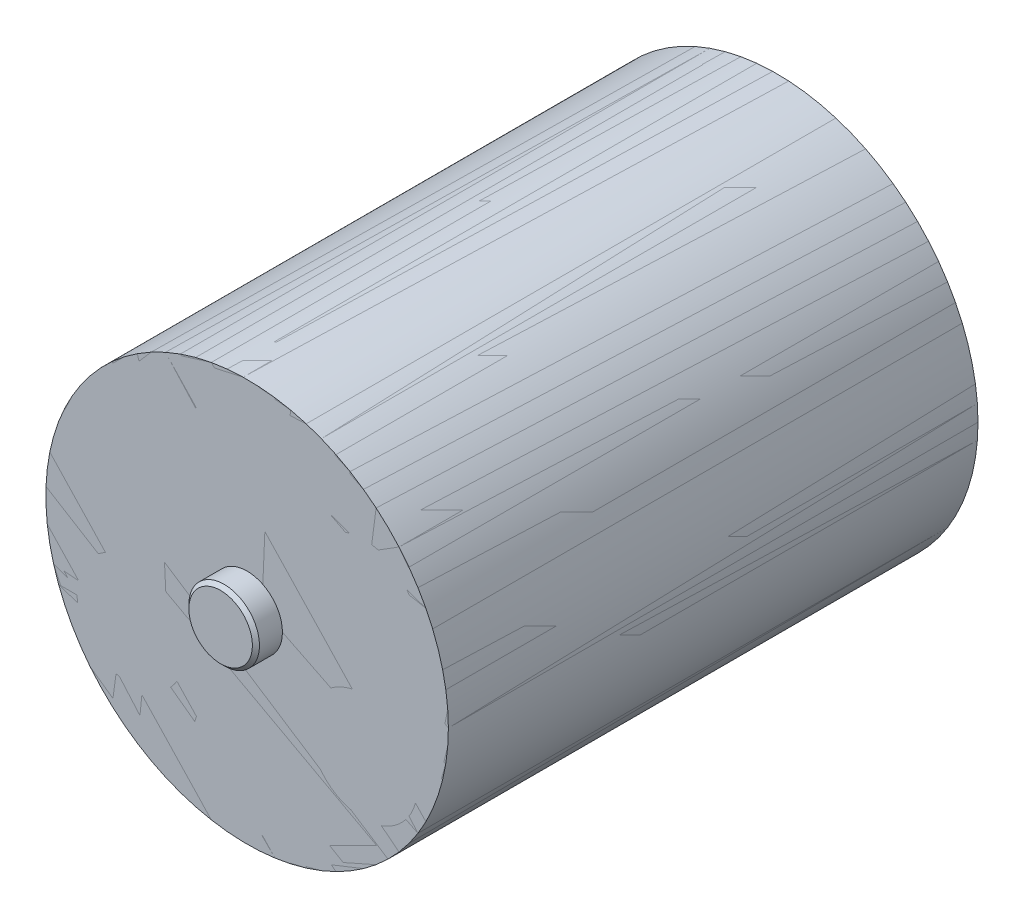
ISO-10303-21;
HEADER;
FILE_DESCRIPTION(('STEP AP214'),'2;1');
FILE_NAME('part.step','',(''),(''),'','','');
FILE_SCHEMA(('AUTOMOTIVE_DESIGN { 1 0 10303 214 1 1 1 1 }'));
ENDSEC;
DATA;
#1=APPLICATION_CONTEXT('core data for automotive mechanical design processes');
#2=APPLICATION_PROTOCOL_DEFINITION('international standard','automotive_design',2000,#1);
#3=PRODUCT_CONTEXT('',#1,'mechanical');
#4=PRODUCT('Part','Part','',(#3));
#5=PRODUCT_RELATED_PRODUCT_CATEGORY('part','',(#4));
#6=PRODUCT_DEFINITION_FORMATION('','',#4);
#7=PRODUCT_DEFINITION_CONTEXT('part definition',#1,'design');
#8=PRODUCT_DEFINITION('design','',#6,#7);
#9=PRODUCT_DEFINITION_SHAPE('','',#8);
#10=(LENGTH_UNIT() NAMED_UNIT(*) SI_UNIT(.MILLI.,.METRE.));
#11=(NAMED_UNIT(*) PLANE_ANGLE_UNIT() SI_UNIT($,.RADIAN.));
#12=(NAMED_UNIT(*) SI_UNIT($,.STERADIAN.) SOLID_ANGLE_UNIT());
#13=UNCERTAINTY_MEASURE_WITH_UNIT(LENGTH_MEASURE(1.E-05),#10,'distance_accuracy_value','');
#14=(GEOMETRIC_REPRESENTATION_CONTEXT(3) GLOBAL_UNCERTAINTY_ASSIGNED_CONTEXT((#13)) GLOBAL_UNIT_ASSIGNED_CONTEXT((#10,
#11,#12)) REPRESENTATION_CONTEXT('',''));
#15=CARTESIAN_POINT('',(0.,0.,0.));
#16=DIRECTION('',(0.,0.,1.));
#17=DIRECTION('',(1.,0.,0.));
#18=AXIS2_PLACEMENT_3D('',#15,#16,#17);
#19=CARTESIAN_POINT('',(271.211975438826,413.994449049259,-472.440692221066));
#20=DIRECTION('',(0.,0.,1.));
#21=DIRECTION('',(1.,0.,0.));
#22=AXIS2_PLACEMENT_3D('',#19,#20,#21);
#23=CYLINDRICAL_SURFACE('',#22,114.);
#24=CARTESIAN_POINT('',(271.211975438826,413.994449049259,-150.));
#25=DIRECTION('',(0.,0.,1.));
#26=DIRECTION('',(1.,0.,0.));
#27=AXIS2_PLACEMENT_3D('',#24,#25,#26);
#28=CIRCLE('',#27,114.);
#29=CARTESIAN_POINT('',(385.211975438826,413.994449049259,-150.));
#30=VERTEX_POINT('',#29);
#31=EDGE_CURVE('E11',#30,#30,#28,.F.);
#32=ORIENTED_EDGE('',*,*,#31,.F.);
#33=EDGE_LOOP('',(#32));
#34=FACE_BOUND('',#33,.T.);
#35=CARTESIAN_POINT('',(271.211975438826,413.994449049259,150.));
#36=DIRECTION('',(0.,0.,1.));
#37=DIRECTION('',(1.,0.,0.));
#38=AXIS2_PLACEMENT_3D('',#35,#36,#37);
#39=CIRCLE('',#38,114.);
#40=CARTESIAN_POINT('',(385.211975438826,413.994449049259,150.));
#41=VERTEX_POINT('',#40);
#42=EDGE_CURVE('E47',#41,#41,#39,.T.);
#43=ORIENTED_EDGE('',*,*,#42,.F.);
#44=EDGE_LOOP('',(#43));
#45=FACE_BOUND('',#44,.T.);
#46=ADVANCED_FACE('F41',(#34,#45),#23,.T.);
#47=CARTESIAN_POINT('',(271.211975438826,413.994449049259,150.));
#48=DIRECTION('',(0.,0.,1.));
#49=DIRECTION('',(1.,0.,0.));
#50=AXIS2_PLACEMENT_3D('',#47,#48,#49);
#51=PLANE('',#50);
#52=ORIENTED_EDGE('',*,*,#42,.T.);
#53=EDGE_LOOP('',(#52));
#54=FACE_BOUND('',#53,.T.);
#55=ADVANCED_FACE('F53',(#54),#51,.T.);
#56=CARTESIAN_POINT('',(271.211975438826,413.994449049259,-150.));
#57=DIRECTION('',(0.,0.,1.));
#58=DIRECTION('',(1.,0.,0.));
#59=AXIS2_PLACEMENT_3D('',#56,#57,#58);
#60=PLANE('',#59);
#61=ORIENTED_EDGE('',*,*,#31,.T.);
#62=EDGE_LOOP('',(#61));
#63=FACE_BOUND('',#62,.T.);
#64=ADVANCED_FACE('F60',(#63),#60,.F.);
#65=CLOSED_SHELL('',(#46,#55,#64));
#66=MANIFOLD_SOLID_BREP('B2',#65);
#67=CARTESIAN_POINT('',(271.211975438826,413.994449049259,150.));
#68=DIRECTION('',(0.,0.,1.));
#69=DIRECTION('',(1.,0.,0.));
#70=AXIS2_PLACEMENT_3D('',#67,#68,#69);
#71=PLANE('',#70);
#72=CARTESIAN_POINT('',(271.211975438826,413.994449049259,150.));
#73=DIRECTION('',(0.,0.,1.));
#74=DIRECTION('',(1.,0.,0.));
#75=AXIS2_PLACEMENT_3D('',#72,#73,#74);
#76=CIRCLE('',#75,114.);
#77=CARTESIAN_POINT('',(385.211975438826,413.994449049259,150.));
#78=VERTEX_POINT('',#77);
#79=EDGE_CURVE('E97',#78,#78,#76,.T.);
#80=ORIENTED_EDGE('',*,*,#79,.T.);
#81=EDGE_LOOP('',(#80));
#82=FACE_BOUND('',#81,.T.);
#83=CARTESIAN_POINT('',(271.211975438826,490.065575895642,150.));
#84=DIRECTION('',(0.,0.,1.));
#85=DIRECTION('',(1.,0.,0.));
#86=AXIS2_PLACEMENT_3D('',#83,#84,#85);
#87=CIRCLE('',#86,30.583998029491);
#88=CARTESIAN_POINT('',(301.795973468317,490.065575895642,150.));
#89=VERTEX_POINT('',#88);
#90=EDGE_CURVE('E103',#89,#89,#87,.T.);
#91=ORIENTED_EDGE('',*,*,#90,.F.);
#92=EDGE_LOOP('',(#91));
#93=FACE_BOUND('',#92,.T.);
#94=CARTESIAN_POINT('',(337.091503782302,452.03001247245,150.));
#95=DIRECTION('',(0.,0.,1.));
#96=DIRECTION('',(0.499999999999998,-0.86602540378444,0.));
#97=AXIS2_PLACEMENT_3D('',#94,#95,#96);
#98=CIRCLE('',#97,30.583998029491);
#99=CARTESIAN_POINT('',(352.383502797047,425.543493229618,150.));
#100=VERTEX_POINT('',#99);
#101=EDGE_CURVE('E109',#100,#100,#98,.T.);
#102=ORIENTED_EDGE('',*,*,#101,.F.);
#103=EDGE_LOOP('',(#102));
#104=FACE_BOUND('',#103,.T.);
#105=CARTESIAN_POINT('',(337.091503782301,375.958885626067,150.));
#106=DIRECTION('',(0.,0.,1.));
#107=DIRECTION('',(-0.500000000000004,-0.866025403784436,0.));
#108=AXIS2_PLACEMENT_3D('',#105,#106,#107);
#109=CIRCLE('',#108,30.583998029491);
#110=CARTESIAN_POINT('',(321.799504767556,349.472366383235,150.));
#111=VERTEX_POINT('',#110);
#112=EDGE_CURVE('E115',#111,#111,#109,.T.);
#113=ORIENTED_EDGE('',*,*,#112,.F.);
#114=EDGE_LOOP('',(#113));
#115=FACE_BOUND('',#114,.T.);
#116=CARTESIAN_POINT('',(271.211975438826,337.923322202876,150.));
#117=DIRECTION('',(0.,0.,1.));
#118=DIRECTION('',(-1.,0.,0.));
#119=AXIS2_PLACEMENT_3D('',#116,#117,#118);
#120=CIRCLE('',#119,30.583998029491);
#121=CARTESIAN_POINT('',(240.627977409335,337.923322202876,150.));
#122=VERTEX_POINT('',#121);
#123=EDGE_CURVE('E121',#122,#122,#120,.T.);
#124=ORIENTED_EDGE('',*,*,#123,.F.);
#125=EDGE_LOOP('',(#124));
#126=FACE_BOUND('',#125,.T.);
#127=CARTESIAN_POINT('',(205.332447095349,375.958885626068,150.));
#128=DIRECTION('',(0.,0.,1.));
#129=DIRECTION('',(-0.499999999999992,0.866025403784443,0.));
#130=AXIS2_PLACEMENT_3D('',#127,#128,#129);
#131=CIRCLE('',#130,30.583998029491);
#132=CARTESIAN_POINT('',(190.040448080604,402.4454048689,150.));
#133=VERTEX_POINT('',#132);
#134=EDGE_CURVE('E127',#133,#133,#131,.T.);
#135=ORIENTED_EDGE('',*,*,#134,.F.);
#136=EDGE_LOOP('',(#135));
#137=FACE_BOUND('',#136,.T.);
#138=CARTESIAN_POINT('',(205.33244709535,452.030012472451,150.));
#139=DIRECTION('',(0.,0.,1.));
#140=DIRECTION('',(0.50000000000001,0.866025403784433,0.));
#141=AXIS2_PLACEMENT_3D('',#138,#139,#140);
#142=CIRCLE('',#141,30.583998029491);
#143=CARTESIAN_POINT('',(220.624446110096,478.516531715283,150.));
#144=VERTEX_POINT('',#143);
#145=EDGE_CURVE('E133',#144,#144,#142,.T.);
#146=ORIENTED_EDGE('',*,*,#145,.F.);
#147=EDGE_LOOP('',(#146));
#148=FACE_BOUND('',#147,.T.);
#149=CARTESIAN_POINT('',(271.211975438826,413.994449049259,150.));
#150=DIRECTION('',(0.,0.,1.));
#151=DIRECTION('',(1.,0.,0.));
#152=AXIS2_PLACEMENT_3D('',#149,#150,#151);
#153=CIRCLE('',#152,20.);
#154=CARTESIAN_POINT('',(291.211975438826,413.994449049259,150.));
#155=VERTEX_POINT('',#154);
#156=EDGE_CURVE('E172',#155,#155,#153,.T.);
#157=ORIENTED_EDGE('',*,*,#156,.F.);
#158=EDGE_LOOP('',(#157));
#159=FACE_BOUND('',#158,.T.);
#160=ADVANCED_FACE('F82',(#82,#93,#104,#115,#126,#137,#148,#159),#71,.T.);
#161=CARTESIAN_POINT('',(271.211975438826,413.994449049259,-150.));
#162=DIRECTION('',(0.,0.,1.));
#163=DIRECTION('',(1.,0.,0.));
#164=AXIS2_PLACEMENT_3D('',#161,#162,#163);
#165=PLANE('',#164);
#166=CARTESIAN_POINT('',(271.211975438826,413.994449049259,-150.));
#167=DIRECTION('',(0.,0.,1.));
#168=DIRECTION('',(1.,0.,0.));
#169=AXIS2_PLACEMENT_3D('',#166,#167,#168);
#170=CIRCLE('',#169,20.);
#171=CARTESIAN_POINT('',(291.211975438826,413.994449049259,-150.));
#172=VERTEX_POINT('',#171);
#173=EDGE_CURVE('E178',#172,#172,#170,.T.);
#174=ORIENTED_EDGE('',*,*,#173,.T.);
#175=EDGE_LOOP('',(#174));
#176=FACE_BOUND('',#175,.T.);
#177=CARTESIAN_POINT('',(205.332447095349,375.958885626068,-150.));
#178=DIRECTION('',(0.,0.,1.));
#179=DIRECTION('',(-0.499999999999992,0.866025403784443,0.));
#180=AXIS2_PLACEMENT_3D('',#177,#178,#179);
#181=CIRCLE('',#180,30.583998029491);
#182=CARTESIAN_POINT('',(190.040448080604,402.4454048689,-150.));
#183=VERTEX_POINT('',#182);
#184=EDGE_CURVE('E163',#183,#183,#181,.T.);
#185=ORIENTED_EDGE('',*,*,#184,.T.);
#186=EDGE_LOOP('',(#185));
#187=FACE_BOUND('',#186,.T.);
#188=CARTESIAN_POINT('',(337.091503782301,375.958885626067,-150.));
#189=DIRECTION('',(0.,0.,1.));
#190=DIRECTION('',(-0.500000000000004,-0.866025403784436,0.));
#191=AXIS2_PLACEMENT_3D('',#188,#189,#190);
#192=CIRCLE('',#191,30.583998029491);
#193=CARTESIAN_POINT('',(321.799504767556,349.472366383235,-150.));
#194=VERTEX_POINT('',#193);
#195=EDGE_CURVE('E151',#194,#194,#192,.T.);
#196=ORIENTED_EDGE('',*,*,#195,.T.);
#197=EDGE_LOOP('',(#196));
#198=FACE_BOUND('',#197,.T.);
#199=CARTESIAN_POINT('',(271.211975438826,490.065575895642,-150.));
#200=DIRECTION('',(0.,0.,1.));
#201=DIRECTION('',(1.,0.,0.));
#202=AXIS2_PLACEMENT_3D('',#199,#200,#201);
#203=CIRCLE('',#202,30.583998029491);
#204=CARTESIAN_POINT('',(301.795973468317,490.065575895642,-150.));
#205=VERTEX_POINT('',#204);
#206=EDGE_CURVE('E139',#205,#205,#203,.T.);
#207=ORIENTED_EDGE('',*,*,#206,.T.);
#208=EDGE_LOOP('',(#207));
#209=FACE_BOUND('',#208,.T.);
#210=CARTESIAN_POINT('',(271.211975438826,413.994449049259,-150.));
#211=DIRECTION('',(0.,0.,1.));
#212=DIRECTION('',(1.,0.,0.));
#213=AXIS2_PLACEMENT_3D('',#210,#211,#212);
#214=CIRCLE('',#213,114.);
#215=CARTESIAN_POINT('',(385.211975438826,413.994449049259,-150.));
#216=VERTEX_POINT('',#215);
#217=EDGE_CURVE('E93',#216,#216,#214,.T.);
#218=ORIENTED_EDGE('',*,*,#217,.F.);
#219=EDGE_LOOP('',(#218));
#220=FACE_BOUND('',#219,.T.);
#221=CARTESIAN_POINT('',(337.091503782302,452.03001247245,-150.));
#222=DIRECTION('',(0.,0.,1.));
#223=DIRECTION('',(0.499999999999998,-0.86602540378444,0.));
#224=AXIS2_PLACEMENT_3D('',#221,#222,#223);
#225=CIRCLE('',#224,30.583998029491);
#226=CARTESIAN_POINT('',(352.383502797047,425.543493229618,-150.));
#227=VERTEX_POINT('',#226);
#228=EDGE_CURVE('E145',#227,#227,#225,.T.);
#229=ORIENTED_EDGE('',*,*,#228,.T.);
#230=EDGE_LOOP('',(#229));
#231=FACE_BOUND('',#230,.T.);
#232=CARTESIAN_POINT('',(271.211975438826,337.923322202876,-150.));
#233=DIRECTION('',(0.,0.,1.));
#234=DIRECTION('',(-1.,0.,0.));
#235=AXIS2_PLACEMENT_3D('',#232,#233,#234);
#236=CIRCLE('',#235,30.583998029491);
#237=CARTESIAN_POINT('',(240.627977409335,337.923322202876,-150.));
#238=VERTEX_POINT('',#237);
#239=EDGE_CURVE('E157',#238,#238,#236,.T.);
#240=ORIENTED_EDGE('',*,*,#239,.T.);
#241=EDGE_LOOP('',(#240));
#242=FACE_BOUND('',#241,.T.);
#243=CARTESIAN_POINT('',(205.33244709535,452.030012472451,-150.));
#244=DIRECTION('',(0.,0.,1.));
#245=DIRECTION('',(0.50000000000001,0.866025403784433,0.));
#246=AXIS2_PLACEMENT_3D('',#243,#244,#245);
#247=CIRCLE('',#246,30.583998029491);
#248=CARTESIAN_POINT('',(220.624446110096,478.516531715283,-150.));
#249=VERTEX_POINT('',#248);
#250=EDGE_CURVE('E169',#249,#249,#247,.T.);
#251=ORIENTED_EDGE('',*,*,#250,.T.);
#252=EDGE_LOOP('',(#251));
#253=FACE_BOUND('',#252,.T.);
#254=ADVANCED_FACE('F195',(#176,#187,#198,#209,#220,#231,#242,#253),#165,.F.);
#255=CARTESIAN_POINT('',(271.211975438826,413.994449049259,-150.));
#256=DIRECTION('',(0.,0.,1.));
#257=DIRECTION('',(1.,0.,0.));
#258=AXIS2_PLACEMENT_3D('',#255,#256,#257);
#259=CYLINDRICAL_SURFACE('',#258,114.);
#260=ORIENTED_EDGE('',*,*,#217,.T.);
#261=EDGE_LOOP('',(#260));
#262=FACE_BOUND('',#261,.T.);
#263=ORIENTED_EDGE('',*,*,#79,.F.);
#264=EDGE_LOOP('',(#263));
#265=FACE_BOUND('',#264,.T.);
#266=ADVANCED_FACE('F201',(#262,#265),#259,.T.);
#267=CARTESIAN_POINT('',(271.211975438826,490.065575895642,145.));
#268=DIRECTION('',(0.,0.,1.));
#269=DIRECTION('',(1.,0.,0.));
#270=AXIS2_PLACEMENT_3D('',#267,#268,#269);
#271=CYLINDRICAL_SURFACE('',#270,30.583998029491);
#272=CARTESIAN_POINT('',(271.211975438826,490.065575895642,145.));
#273=DIRECTION('',(0.,0.,1.));
#274=DIRECTION('',(1.,0.,0.));
#275=AXIS2_PLACEMENT_3D('',#272,#273,#274);
#276=CIRCLE('',#275,30.583998029491);
#277=CARTESIAN_POINT('',(301.795973468317,490.065575895642,145.));
#278=VERTEX_POINT('',#277);
#279=EDGE_CURVE('E101',#278,#278,#276,.T.);
#280=ORIENTED_EDGE('',*,*,#279,.F.);
#281=EDGE_LOOP('',(#280));
#282=FACE_BOUND('',#281,.T.);
#283=ORIENTED_EDGE('',*,*,#90,.T.);
#284=EDGE_LOOP('',(#283));
#285=FACE_BOUND('',#284,.T.);
#286=ADVANCED_FACE('F207',(#282,#285),#271,.F.);
#287=CARTESIAN_POINT('',(271.211975438826,490.065575895642,145.));
#288=DIRECTION('',(0.,0.,1.));
#289=DIRECTION('',(1.,0.,0.));
#290=AXIS2_PLACEMENT_3D('',#287,#288,#289);
#291=PLANE('',#290);
#292=ORIENTED_EDGE('',*,*,#279,.T.);
#293=EDGE_LOOP('',(#292));
#294=FACE_BOUND('',#293,.T.);
#295=ADVANCED_FACE('F212',(#294),#291,.T.);
#296=CARTESIAN_POINT('',(337.091503782302,452.03001247245,145.));
#297=DIRECTION('',(0.,0.,1.));
#298=DIRECTION('',(1.,0.,0.));
#299=AXIS2_PLACEMENT_3D('',#296,#297,#298);
#300=CYLINDRICAL_SURFACE('',#299,30.583998029491);
#301=CARTESIAN_POINT('',(337.091503782302,452.03001247245,145.));
#302=DIRECTION('',(0.,0.,1.));
#303=DIRECTION('',(0.499999999999998,-0.86602540378444,0.));
#304=AXIS2_PLACEMENT_3D('',#301,#302,#303);
#305=CIRCLE('',#304,30.583998029491);
#306=CARTESIAN_POINT('',(352.383502797047,425.543493229618,145.));
#307=VERTEX_POINT('',#306);
#308=EDGE_CURVE('E106',#307,#307,#305,.T.);
#309=ORIENTED_EDGE('',*,*,#308,.F.);
#310=EDGE_LOOP('',(#309));
#311=FACE_BOUND('',#310,.T.);
#312=ORIENTED_EDGE('',*,*,#101,.T.);
#313=EDGE_LOOP('',(#312));
#314=FACE_BOUND('',#313,.T.);
#315=ADVANCED_FACE('F313',(#311,#314),#300,.F.);
#316=CARTESIAN_POINT('',(337.091503782302,452.03001247245,145.));
#317=DIRECTION('',(0.,0.,1.));
#318=DIRECTION('',(0.499999999999998,-0.86602540378444,0.));
#319=AXIS2_PLACEMENT_3D('',#316,#317,#318);
#320=PLANE('',#319);
#321=ORIENTED_EDGE('',*,*,#308,.T.);
#322=EDGE_LOOP('',(#321));
#323=FACE_BOUND('',#322,.T.);
#324=ADVANCED_FACE('F309',(#323),#320,.T.);
#325=CARTESIAN_POINT('',(337.091503782301,375.958885626067,145.));
#326=DIRECTION('',(0.,0.,1.));
#327=DIRECTION('',(1.,0.,0.));
#328=AXIS2_PLACEMENT_3D('',#325,#326,#327);
#329=CYLINDRICAL_SURFACE('',#328,30.583998029491);
#330=CARTESIAN_POINT('',(337.091503782301,375.958885626067,145.));
#331=DIRECTION('',(0.,0.,1.));
#332=DIRECTION('',(-0.500000000000004,-0.866025403784436,0.));
#333=AXIS2_PLACEMENT_3D('',#330,#331,#332);
#334=CIRCLE('',#333,30.583998029491);
#335=CARTESIAN_POINT('',(321.799504767556,349.472366383235,145.));
#336=VERTEX_POINT('',#335);
#337=EDGE_CURVE('E112',#336,#336,#334,.T.);
#338=ORIENTED_EDGE('',*,*,#337,.F.);
#339=EDGE_LOOP('',(#338));
#340=FACE_BOUND('',#339,.T.);
#341=ORIENTED_EDGE('',*,*,#112,.T.);
#342=EDGE_LOOP('',(#341));
#343=FACE_BOUND('',#342,.T.);
#344=ADVANCED_FACE('F305',(#340,#343),#329,.F.);
#345=CARTESIAN_POINT('',(337.091503782301,375.958885626067,145.));
#346=DIRECTION('',(0.,0.,1.));
#347=DIRECTION('',(-0.500000000000004,-0.866025403784436,0.));
#348=AXIS2_PLACEMENT_3D('',#345,#346,#347);
#349=PLANE('',#348);
#350=ORIENTED_EDGE('',*,*,#337,.T.);
#351=EDGE_LOOP('',(#350));
#352=FACE_BOUND('',#351,.T.);
#353=ADVANCED_FACE('F301',(#352),#349,.T.);
#354=CARTESIAN_POINT('',(271.211975438826,337.923322202876,145.));
#355=DIRECTION('',(0.,0.,1.));
#356=DIRECTION('',(1.,0.,0.));
#357=AXIS2_PLACEMENT_3D('',#354,#355,#356);
#358=CYLINDRICAL_SURFACE('',#357,30.583998029491);
#359=CARTESIAN_POINT('',(271.211975438826,337.923322202876,145.));
#360=DIRECTION('',(0.,0.,1.));
#361=DIRECTION('',(-1.,0.,0.));
#362=AXIS2_PLACEMENT_3D('',#359,#360,#361);
#363=CIRCLE('',#362,30.583998029491);
#364=CARTESIAN_POINT('',(240.627977409335,337.923322202876,145.));
#365=VERTEX_POINT('',#364);
#366=EDGE_CURVE('E118',#365,#365,#363,.T.);
#367=ORIENTED_EDGE('',*,*,#366,.F.);
#368=EDGE_LOOP('',(#367));
#369=FACE_BOUND('',#368,.T.);
#370=ORIENTED_EDGE('',*,*,#123,.T.);
#371=EDGE_LOOP('',(#370));
#372=FACE_BOUND('',#371,.T.);
#373=ADVANCED_FACE('F297',(#369,#372),#358,.F.);
#374=CARTESIAN_POINT('',(271.211975438826,337.923322202876,145.));
#375=DIRECTION('',(0.,0.,1.));
#376=DIRECTION('',(-1.,0.,0.));
#377=AXIS2_PLACEMENT_3D('',#374,#375,#376);
#378=PLANE('',#377);
#379=ORIENTED_EDGE('',*,*,#366,.T.);
#380=EDGE_LOOP('',(#379));
#381=FACE_BOUND('',#380,.T.);
#382=ADVANCED_FACE('F293',(#381),#378,.T.);
#383=CARTESIAN_POINT('',(205.332447095349,375.958885626068,145.));
#384=DIRECTION('',(0.,0.,1.));
#385=DIRECTION('',(1.,0.,0.));
#386=AXIS2_PLACEMENT_3D('',#383,#384,#385);
#387=CYLINDRICAL_SURFACE('',#386,30.583998029491);
#388=CARTESIAN_POINT('',(205.332447095349,375.958885626068,145.));
#389=DIRECTION('',(0.,0.,1.));
#390=DIRECTION('',(-0.499999999999992,0.866025403784443,0.));
#391=AXIS2_PLACEMENT_3D('',#388,#389,#390);
#392=CIRCLE('',#391,30.583998029491);
#393=CARTESIAN_POINT('',(190.040448080604,402.4454048689,145.));
#394=VERTEX_POINT('',#393);
#395=EDGE_CURVE('E124',#394,#394,#392,.T.);
#396=ORIENTED_EDGE('',*,*,#395,.F.);
#397=EDGE_LOOP('',(#396));
#398=FACE_BOUND('',#397,.T.);
#399=ORIENTED_EDGE('',*,*,#134,.T.);
#400=EDGE_LOOP('',(#399));
#401=FACE_BOUND('',#400,.T.);
#402=ADVANCED_FACE('F289',(#398,#401),#387,.F.);
#403=CARTESIAN_POINT('',(205.332447095349,375.958885626068,145.));
#404=DIRECTION('',(0.,0.,1.));
#405=DIRECTION('',(-0.499999999999992,0.866025403784443,0.));
#406=AXIS2_PLACEMENT_3D('',#403,#404,#405);
#407=PLANE('',#406);
#408=ORIENTED_EDGE('',*,*,#395,.T.);
#409=EDGE_LOOP('',(#408));
#410=FACE_BOUND('',#409,.T.);
#411=ADVANCED_FACE('F285',(#410),#407,.T.);
#412=CARTESIAN_POINT('',(205.33244709535,452.030012472451,145.));
#413=DIRECTION('',(0.,0.,1.));
#414=DIRECTION('',(1.,0.,0.));
#415=AXIS2_PLACEMENT_3D('',#412,#413,#414);
#416=CYLINDRICAL_SURFACE('',#415,30.583998029491);
#417=CARTESIAN_POINT('',(205.33244709535,452.030012472451,145.));
#418=DIRECTION('',(0.,0.,1.));
#419=DIRECTION('',(0.50000000000001,0.866025403784433,0.));
#420=AXIS2_PLACEMENT_3D('',#417,#418,#419);
#421=CIRCLE('',#420,30.583998029491);
#422=CARTESIAN_POINT('',(220.624446110096,478.516531715283,145.));
#423=VERTEX_POINT('',#422);
#424=EDGE_CURVE('E130',#423,#423,#421,.T.);
#425=ORIENTED_EDGE('',*,*,#424,.F.);
#426=EDGE_LOOP('',(#425));
#427=FACE_BOUND('',#426,.T.);
#428=ORIENTED_EDGE('',*,*,#145,.T.);
#429=EDGE_LOOP('',(#428));
#430=FACE_BOUND('',#429,.T.);
#431=ADVANCED_FACE('F281',(#427,#430),#416,.F.);
#432=CARTESIAN_POINT('',(205.33244709535,452.030012472451,145.));
#433=DIRECTION('',(0.,0.,1.));
#434=DIRECTION('',(0.50000000000001,0.866025403784433,0.));
#435=AXIS2_PLACEMENT_3D('',#432,#433,#434);
#436=PLANE('',#435);
#437=ORIENTED_EDGE('',*,*,#424,.T.);
#438=EDGE_LOOP('',(#437));
#439=FACE_BOUND('',#438,.T.);
#440=ADVANCED_FACE('F277',(#439),#436,.T.);
#441=CARTESIAN_POINT('',(271.211975438826,490.065575895642,-145.));
#442=DIRECTION('',(0.,0.,-1.));
#443=DIRECTION('',(-1.,0.,0.));
#444=AXIS2_PLACEMENT_3D('',#441,#442,#443);
#445=CYLINDRICAL_SURFACE('',#444,30.583998029491);
#446=CARTESIAN_POINT('',(271.211975438826,490.065575895642,-145.));
#447=DIRECTION('',(0.,0.,1.));
#448=DIRECTION('',(1.,0.,0.));
#449=AXIS2_PLACEMENT_3D('',#446,#447,#448);
#450=CIRCLE('',#449,30.583998029491);
#451=CARTESIAN_POINT('',(301.795973468317,490.065575895642,-145.));
#452=VERTEX_POINT('',#451);
#453=EDGE_CURVE('E136',#452,#452,#450,.T.);
#454=ORIENTED_EDGE('',*,*,#453,.T.);
#455=EDGE_LOOP('',(#454));
#456=FACE_BOUND('',#455,.T.);
#457=ORIENTED_EDGE('',*,*,#206,.F.);
#458=EDGE_LOOP('',(#457));
#459=FACE_BOUND('',#458,.T.);
#460=ADVANCED_FACE('F273',(#456,#459),#445,.F.);
#461=CARTESIAN_POINT('',(271.211975438826,490.065575895642,-145.));
#462=DIRECTION('',(0.,0.,-1.));
#463=DIRECTION('',(1.,0.,0.));
#464=AXIS2_PLACEMENT_3D('',#461,#462,#463);
#465=PLANE('',#464);
#466=ORIENTED_EDGE('',*,*,#453,.F.);
#467=EDGE_LOOP('',(#466));
#468=FACE_BOUND('',#467,.T.);
#469=ADVANCED_FACE('F269',(#468),#465,.T.);
#470=CARTESIAN_POINT('',(337.091503782302,452.03001247245,-145.));
#471=DIRECTION('',(0.,0.,-1.));
#472=DIRECTION('',(-1.,0.,0.));
#473=AXIS2_PLACEMENT_3D('',#470,#471,#472);
#474=CYLINDRICAL_SURFACE('',#473,30.583998029491);
#475=CARTESIAN_POINT('',(337.091503782302,452.03001247245,-145.));
#476=DIRECTION('',(0.,0.,1.));
#477=DIRECTION('',(0.499999999999998,-0.86602540378444,0.));
#478=AXIS2_PLACEMENT_3D('',#475,#476,#477);
#479=CIRCLE('',#478,30.583998029491);
#480=CARTESIAN_POINT('',(352.383502797047,425.543493229618,-145.));
#481=VERTEX_POINT('',#480);
#482=EDGE_CURVE('E142',#481,#481,#479,.T.);
#483=ORIENTED_EDGE('',*,*,#482,.T.);
#484=EDGE_LOOP('',(#483));
#485=FACE_BOUND('',#484,.T.);
#486=ORIENTED_EDGE('',*,*,#228,.F.);
#487=EDGE_LOOP('',(#486));
#488=FACE_BOUND('',#487,.T.);
#489=ADVANCED_FACE('F265',(#485,#488),#474,.F.);
#490=CARTESIAN_POINT('',(337.091503782302,452.03001247245,-145.));
#491=DIRECTION('',(0.,0.,-1.));
#492=DIRECTION('',(0.499999999999998,-0.86602540378444,0.));
#493=AXIS2_PLACEMENT_3D('',#490,#491,#492);
#494=PLANE('',#493);
#495=ORIENTED_EDGE('',*,*,#482,.F.);
#496=EDGE_LOOP('',(#495));
#497=FACE_BOUND('',#496,.T.);
#498=ADVANCED_FACE('F261',(#497),#494,.T.);
#499=CARTESIAN_POINT('',(337.091503782301,375.958885626067,-145.));
#500=DIRECTION('',(0.,0.,-1.));
#501=DIRECTION('',(-1.,0.,0.));
#502=AXIS2_PLACEMENT_3D('',#499,#500,#501);
#503=CYLINDRICAL_SURFACE('',#502,30.583998029491);
#504=CARTESIAN_POINT('',(337.091503782301,375.958885626067,-145.));
#505=DIRECTION('',(0.,0.,1.));
#506=DIRECTION('',(-0.500000000000004,-0.866025403784436,0.));
#507=AXIS2_PLACEMENT_3D('',#504,#505,#506);
#508=CIRCLE('',#507,30.583998029491);
#509=CARTESIAN_POINT('',(321.799504767556,349.472366383235,-145.));
#510=VERTEX_POINT('',#509);
#511=EDGE_CURVE('E148',#510,#510,#508,.T.);
#512=ORIENTED_EDGE('',*,*,#511,.T.);
#513=EDGE_LOOP('',(#512));
#514=FACE_BOUND('',#513,.T.);
#515=ORIENTED_EDGE('',*,*,#195,.F.);
#516=EDGE_LOOP('',(#515));
#517=FACE_BOUND('',#516,.T.);
#518=ADVANCED_FACE('F257',(#514,#517),#503,.F.);
#519=CARTESIAN_POINT('',(337.091503782301,375.958885626067,-145.));
#520=DIRECTION('',(0.,0.,-1.));
#521=DIRECTION('',(-0.500000000000004,-0.866025403784436,0.));
#522=AXIS2_PLACEMENT_3D('',#519,#520,#521);
#523=PLANE('',#522);
#524=ORIENTED_EDGE('',*,*,#511,.F.);
#525=EDGE_LOOP('',(#524));
#526=FACE_BOUND('',#525,.T.);
#527=ADVANCED_FACE('F253',(#526),#523,.T.);
#528=CARTESIAN_POINT('',(271.211975438826,337.923322202876,-145.));
#529=DIRECTION('',(0.,0.,-1.));
#530=DIRECTION('',(-1.,0.,0.));
#531=AXIS2_PLACEMENT_3D('',#528,#529,#530);
#532=CYLINDRICAL_SURFACE('',#531,30.583998029491);
#533=CARTESIAN_POINT('',(271.211975438826,337.923322202876,-145.));
#534=DIRECTION('',(0.,0.,1.));
#535=DIRECTION('',(-1.,0.,0.));
#536=AXIS2_PLACEMENT_3D('',#533,#534,#535);
#537=CIRCLE('',#536,30.583998029491);
#538=CARTESIAN_POINT('',(240.627977409335,337.923322202876,-145.));
#539=VERTEX_POINT('',#538);
#540=EDGE_CURVE('E154',#539,#539,#537,.T.);
#541=ORIENTED_EDGE('',*,*,#540,.T.);
#542=EDGE_LOOP('',(#541));
#543=FACE_BOUND('',#542,.T.);
#544=ORIENTED_EDGE('',*,*,#239,.F.);
#545=EDGE_LOOP('',(#544));
#546=FACE_BOUND('',#545,.T.);
#547=ADVANCED_FACE('F249',(#543,#546),#532,.F.);
#548=CARTESIAN_POINT('',(271.211975438826,337.923322202876,-145.));
#549=DIRECTION('',(0.,0.,-1.));
#550=DIRECTION('',(-1.,0.,0.));
#551=AXIS2_PLACEMENT_3D('',#548,#549,#550);
#552=PLANE('',#551);
#553=ORIENTED_EDGE('',*,*,#540,.F.);
#554=EDGE_LOOP('',(#553));
#555=FACE_BOUND('',#554,.T.);
#556=ADVANCED_FACE('F245',(#555),#552,.T.);
#557=CARTESIAN_POINT('',(205.332447095349,375.958885626068,-145.));
#558=DIRECTION('',(0.,0.,-1.));
#559=DIRECTION('',(-1.,0.,0.));
#560=AXIS2_PLACEMENT_3D('',#557,#558,#559);
#561=CYLINDRICAL_SURFACE('',#560,30.583998029491);
#562=CARTESIAN_POINT('',(205.332447095349,375.958885626068,-145.));
#563=DIRECTION('',(0.,0.,1.));
#564=DIRECTION('',(-0.499999999999992,0.866025403784443,0.));
#565=AXIS2_PLACEMENT_3D('',#562,#563,#564);
#566=CIRCLE('',#565,30.583998029491);
#567=CARTESIAN_POINT('',(190.040448080604,402.4454048689,-145.));
#568=VERTEX_POINT('',#567);
#569=EDGE_CURVE('E160',#568,#568,#566,.T.);
#570=ORIENTED_EDGE('',*,*,#569,.T.);
#571=EDGE_LOOP('',(#570));
#572=FACE_BOUND('',#571,.T.);
#573=ORIENTED_EDGE('',*,*,#184,.F.);
#574=EDGE_LOOP('',(#573));
#575=FACE_BOUND('',#574,.T.);
#576=ADVANCED_FACE('F238',(#572,#575),#561,.F.);
#577=CARTESIAN_POINT('',(205.332447095349,375.958885626068,-145.));
#578=DIRECTION('',(0.,0.,-1.));
#579=DIRECTION('',(-0.499999999999992,0.866025403784443,0.));
#580=AXIS2_PLACEMENT_3D('',#577,#578,#579);
#581=PLANE('',#580);
#582=ORIENTED_EDGE('',*,*,#569,.F.);
#583=EDGE_LOOP('',(#582));
#584=FACE_BOUND('',#583,.T.);
#585=ADVANCED_FACE('F228',(#584),#581,.T.);
#586=CARTESIAN_POINT('',(205.33244709535,452.030012472451,-145.));
#587=DIRECTION('',(0.,0.,-1.));
#588=DIRECTION('',(-1.,0.,0.));
#589=AXIS2_PLACEMENT_3D('',#586,#587,#588);
#590=CYLINDRICAL_SURFACE('',#589,30.583998029491);
#591=CARTESIAN_POINT('',(205.33244709535,452.030012472451,-145.));
#592=DIRECTION('',(0.,0.,1.));
#593=DIRECTION('',(0.50000000000001,0.866025403784433,0.));
#594=AXIS2_PLACEMENT_3D('',#591,#592,#593);
#595=CIRCLE('',#594,30.583998029491);
#596=CARTESIAN_POINT('',(220.624446110096,478.516531715283,-145.));
#597=VERTEX_POINT('',#596);
#598=EDGE_CURVE('E166',#597,#597,#595,.T.);
#599=ORIENTED_EDGE('',*,*,#598,.T.);
#600=EDGE_LOOP('',(#599));
#601=FACE_BOUND('',#600,.T.);
#602=ORIENTED_EDGE('',*,*,#250,.F.);
#603=EDGE_LOOP('',(#602));
#604=FACE_BOUND('',#603,.T.);
#605=ADVANCED_FACE('F225',(#601,#604),#590,.F.);
#606=CARTESIAN_POINT('',(205.33244709535,452.030012472451,-145.));
#607=DIRECTION('',(0.,0.,-1.));
#608=DIRECTION('',(0.50000000000001,0.866025403784433,0.));
#609=AXIS2_PLACEMENT_3D('',#606,#607,#608);
#610=PLANE('',#609);
#611=ORIENTED_EDGE('',*,*,#598,.F.);
#612=EDGE_LOOP('',(#611));
#613=FACE_BOUND('',#612,.T.);
#614=ADVANCED_FACE('F227',(#613),#610,.T.);
#615=CARTESIAN_POINT('',(271.211975438826,413.994449049259,165.));
#616=DIRECTION('',(0.,0.,-1.));
#617=DIRECTION('',(-1.,0.,0.));
#618=AXIS2_PLACEMENT_3D('',#615,#616,#617);
#619=CYLINDRICAL_SURFACE('',#618,20.);
#620=CARTESIAN_POINT('',(271.211975438826,413.994449049259,163.));
#621=DIRECTION('',(0.,0.,1.));
#622=DIRECTION('',(1.,0.,0.));
#623=AXIS2_PLACEMENT_3D('',#620,#621,#622);
#624=CIRCLE('',#623,20.);
#625=CARTESIAN_POINT('',(291.211975438826,413.994449049259,163.));
#626=VERTEX_POINT('',#625);
#627=EDGE_CURVE('E40',#626,#626,#624,.F.);
#628=ORIENTED_EDGE('',*,*,#627,.T.);
#629=EDGE_LOOP('',(#628));
#630=FACE_BOUND('',#629,.T.);
#631=ORIENTED_EDGE('',*,*,#156,.T.);
#632=EDGE_LOOP('',(#631));
#633=FACE_BOUND('',#632,.T.);
#634=ADVANCED_FACE('F235',(#630,#633),#619,.T.);
#635=CARTESIAN_POINT('',(271.211975438826,413.994449049259,165.));
#636=DIRECTION('',(0.,0.,1.));
#637=DIRECTION('',(1.,0.,0.));
#638=AXIS2_PLACEMENT_3D('',#635,#636,#637);
#639=PLANE('',#638);
#640=CARTESIAN_POINT('',(271.211975438826,413.994449049259,165.));
#641=DIRECTION('',(0.,0.,1.));
#642=DIRECTION('',(1.,0.,0.));
#643=AXIS2_PLACEMENT_3D('',#640,#641,#642);
#644=CIRCLE('',#643,18.);
#645=CARTESIAN_POINT('',(289.211975438826,413.994449049259,165.));
#646=VERTEX_POINT('',#645);
#647=EDGE_CURVE('E89',#646,#646,#644,.T.);
#648=ORIENTED_EDGE('',*,*,#647,.T.);
#649=EDGE_LOOP('',(#648));
#650=FACE_BOUND('',#649,.T.);
#651=ADVANCED_FACE('F339',(#650),#639,.T.);
#652=CARTESIAN_POINT('',(271.211975438826,413.994449049259,165.));
#653=DIRECTION('',(0.,0.,-1.));
#654=DIRECTION('',(-1.,0.,0.));
#655=AXIS2_PLACEMENT_3D('',#652,#653,#654);
#656=CONICAL_SURFACE('',#655,18.,0.785398163397449);
#657=ORIENTED_EDGE('',*,*,#627,.F.);
#658=EDGE_LOOP('',(#657));
#659=FACE_BOUND('',#658,.T.);
#660=ORIENTED_EDGE('',*,*,#647,.F.);
#661=EDGE_LOOP('',(#660));
#662=FACE_BOUND('',#661,.T.);
#663=ADVANCED_FACE('F84',(#659,#662),#656,.T.);
#664=CARTESIAN_POINT('',(271.211975438826,413.994449049259,-165.));
#665=DIRECTION('',(0.,0.,1.));
#666=DIRECTION('',(1.,0.,0.));
#667=AXIS2_PLACEMENT_3D('',#664,#665,#666);
#668=CYLINDRICAL_SURFACE('',#667,20.);
#669=CARTESIAN_POINT('',(271.211975438826,413.994449049259,-165.));
#670=DIRECTION('',(0.,0.,1.));
#671=DIRECTION('',(1.,0.,0.));
#672=AXIS2_PLACEMENT_3D('',#669,#670,#671);
#673=CIRCLE('',#672,20.);
#674=CARTESIAN_POINT('',(291.211975438826,413.994449049259,-165.));
#675=VERTEX_POINT('',#674);
#676=EDGE_CURVE('E177',#675,#675,#673,.T.);
#677=ORIENTED_EDGE('',*,*,#676,.T.);
#678=EDGE_LOOP('',(#677));
#679=FACE_BOUND('',#678,.T.);
#680=ORIENTED_EDGE('',*,*,#173,.F.);
#681=EDGE_LOOP('',(#680));
#682=FACE_BOUND('',#681,.T.);
#683=ADVANCED_FACE('F184',(#679,#682),#668,.T.);
#684=CARTESIAN_POINT('',(271.211975438826,413.994449049259,-165.));
#685=DIRECTION('',(0.,0.,-1.));
#686=DIRECTION('',(1.,0.,0.));
#687=AXIS2_PLACEMENT_3D('',#684,#685,#686);
#688=PLANE('',#687);
#689=ORIENTED_EDGE('',*,*,#676,.F.);
#690=EDGE_LOOP('',(#689));
#691=FACE_BOUND('',#690,.T.);
#692=ADVANCED_FACE('F187',(#691),#688,.T.);
#693=CLOSED_SHELL('',(#160,#254,#266,#286,#295,#315,#324,#344,#353,#373,#382,#402,#411,#431,
#440,#460,#469,#489,#498,#518,#527,#547,#556,#576,#585,#605,#614,#634,#651,#663,#683,#692));
#694=MANIFOLD_SOLID_BREP('B6',#693);
#695=ADVANCED_BREP_SHAPE_REPRESENTATION('',(#18,#66,#694),#14);
#696=SHAPE_DEFINITION_REPRESENTATION(#9,#695);
ENDSEC;
END-ISO-10303-21;
